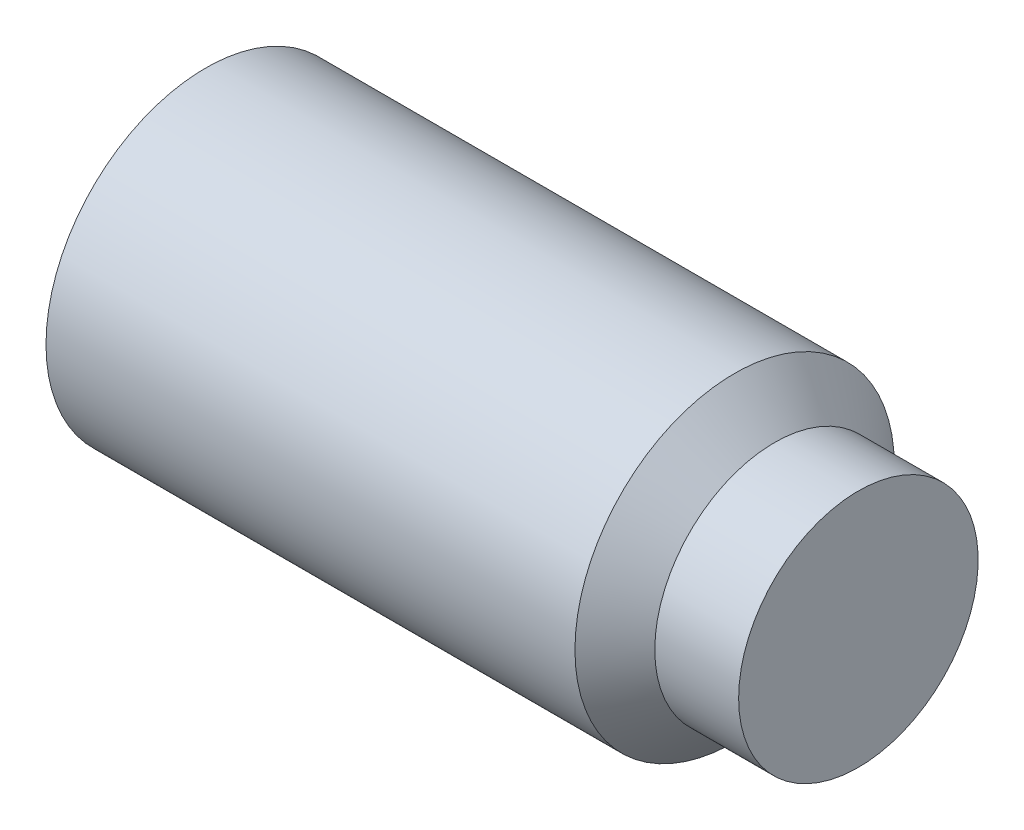
ISO-10303-21;
HEADER;
FILE_DESCRIPTION(('STEP AP214'),'2;1');
FILE_NAME('part.step','',(''),(''),'','','');
FILE_SCHEMA(('AUTOMOTIVE_DESIGN { 1 0 10303 214 1 1 1 1 }'));
ENDSEC;
DATA;
#1=APPLICATION_CONTEXT('core data for automotive mechanical design processes');
#2=APPLICATION_PROTOCOL_DEFINITION('international standard','automotive_design',2000,#1);
#3=PRODUCT_CONTEXT('',#1,'mechanical');
#4=PRODUCT('Part','Part','',(#3));
#5=PRODUCT_RELATED_PRODUCT_CATEGORY('part','',(#4));
#6=PRODUCT_DEFINITION_FORMATION('','',#4);
#7=PRODUCT_DEFINITION_CONTEXT('part definition',#1,'design');
#8=PRODUCT_DEFINITION('design','',#6,#7);
#9=PRODUCT_DEFINITION_SHAPE('','',#8);
#10=(LENGTH_UNIT() NAMED_UNIT(*) SI_UNIT(.MILLI.,.METRE.));
#11=(NAMED_UNIT(*) PLANE_ANGLE_UNIT() SI_UNIT($,.RADIAN.));
#12=(NAMED_UNIT(*) SI_UNIT($,.STERADIAN.) SOLID_ANGLE_UNIT());
#13=UNCERTAINTY_MEASURE_WITH_UNIT(LENGTH_MEASURE(1.E-05),#10,'distance_accuracy_value','');
#14=(GEOMETRIC_REPRESENTATION_CONTEXT(3) GLOBAL_UNCERTAINTY_ASSIGNED_CONTEXT((#13)) GLOBAL_UNIT_ASSIGNED_CONTEXT((#10,
#11,#12)) REPRESENTATION_CONTEXT('',''));
#15=CARTESIAN_POINT('',(0.,0.,0.));
#16=DIRECTION('',(0.,0.,1.));
#17=DIRECTION('',(1.,0.,0.));
#18=AXIS2_PLACEMENT_3D('',#15,#16,#17);
#19=CARTESIAN_POINT('',(0.,0.,0.));
#20=DIRECTION('',(-1.,0.,0.));
#21=DIRECTION('',(0.,0.,1.));
#22=AXIS2_PLACEMENT_3D('',#19,#20,#21);
#23=PLANE('',#22);
#24=CARTESIAN_POINT('',(0.,0.,0.));
#25=DIRECTION('',(-1.,0.,0.));
#26=DIRECTION('',(0.,0.,1.));
#27=AXIS2_PLACEMENT_3D('',#24,#25,#26);
#28=CIRCLE('',#27,10.352);
#29=CARTESIAN_POINT('',(0.,0.,10.352));
#30=VERTEX_POINT('',#29);
#31=EDGE_CURVE('E11',#30,#30,#28,.T.);
#32=ORIENTED_EDGE('',*,*,#31,.T.);
#33=EDGE_LOOP('',(#32));
#34=FACE_BOUND('',#33,.T.);
#35=DIRECTION('',(0.,0.,-1.));
#36=VECTOR('',#35,1.);
#37=CARTESIAN_POINT('',(0.,6.,3.46410161513775));
#38=LINE('',#37,#36);
#39=CARTESIAN_POINT('',(0.,6.,3.46410161513775));
#40=VERTEX_POINT('',#39);
#41=CARTESIAN_POINT('',(0.,6.,-3.46410161513776));
#42=VERTEX_POINT('',#41);
#43=EDGE_CURVE('E126',#40,#42,#38,.T.);
#44=ORIENTED_EDGE('',*,*,#43,.F.);
#45=DIRECTION('',(0.,-0.866025403784439,0.5));
#46=VECTOR('',#45,1.);
#47=CARTESIAN_POINT('',(0.,6.,3.46410161513775));
#48=LINE('',#47,#46);
#49=CARTESIAN_POINT('',(0.,0.,6.9282032302755));
#50=VERTEX_POINT('',#49);
#51=EDGE_CURVE('E48',#40,#50,#48,.T.);
#52=ORIENTED_EDGE('',*,*,#51,.T.);
#53=DIRECTION('',(0.,0.866025403784439,0.5));
#54=VECTOR('',#53,1.);
#55=CARTESIAN_POINT('',(0.,-5.99999999999999,3.46410161513775));
#56=LINE('',#55,#54);
#57=CARTESIAN_POINT('',(0.,-5.99999999999999,3.46410161513775));
#58=VERTEX_POINT('',#57);
#59=EDGE_CURVE('E117',#58,#50,#56,.T.);
#60=ORIENTED_EDGE('',*,*,#59,.F.);
#61=DIRECTION('',(0.,0.,-1.));
#62=VECTOR('',#61,1.);
#63=CARTESIAN_POINT('',(0.,-5.99999999999999,3.46410161513775));
#64=LINE('',#63,#62);
#65=CARTESIAN_POINT('',(0.,-5.99999999999999,-3.46410161513776));
#66=VERTEX_POINT('',#65);
#67=EDGE_CURVE('E120',#58,#66,#64,.T.);
#68=ORIENTED_EDGE('',*,*,#67,.T.);
#69=DIRECTION('',(0.,0.866025403784438,-0.5));
#70=VECTOR('',#69,1.);
#71=CARTESIAN_POINT('',(0.,-5.99999999999999,-3.46410161513776));
#72=LINE('',#71,#70);
#73=CARTESIAN_POINT('',(0.,0.,-6.92820323027551));
#74=VERTEX_POINT('',#73);
#75=EDGE_CURVE('E123',#66,#74,#72,.T.);
#76=ORIENTED_EDGE('',*,*,#75,.T.);
#77=DIRECTION('',(0.,-0.866025403784439,-0.5));
#78=VECTOR('',#77,1.);
#79=CARTESIAN_POINT('',(0.,6.,-3.46410161513776));
#80=LINE('',#79,#78);
#81=EDGE_CURVE('E106',#42,#74,#80,.T.);
#82=ORIENTED_EDGE('',*,*,#81,.F.);
#83=EDGE_LOOP('',(#44,#52,#60,#68,#76,#82));
#84=FACE_BOUND('',#83,.T.);
#85=ADVANCED_FACE('F34',(#34,#84),#23,.T.);
#86=CARTESIAN_POINT('',(0.,0.,0.));
#87=DIRECTION('',(1.,0.,0.));
#88=DIRECTION('',(0.,0.,-1.));
#89=AXIS2_PLACEMENT_3D('',#86,#87,#88);
#90=CONICAL_SURFACE('',#89,10.352,1.04719755119662);
#91=CARTESIAN_POINT('',(0.951473243624452,0.,0.));
#92=DIRECTION('',(-1.,0.,0.));
#93=DIRECTION('',(0.,0.,1.));
#94=AXIS2_PLACEMENT_3D('',#91,#92,#93);
#95=CIRCLE('',#94,12.);
#96=CARTESIAN_POINT('',(0.951473243624452,0.,12.));
#97=VERTEX_POINT('',#96);
#98=EDGE_CURVE('E41',#97,#97,#95,.T.);
#99=ORIENTED_EDGE('',*,*,#98,.T.);
#100=EDGE_LOOP('',(#99));
#101=FACE_BOUND('',#100,.T.);
#102=ORIENTED_EDGE('',*,*,#31,.F.);
#103=EDGE_LOOP('',(#102));
#104=FACE_BOUND('',#103,.T.);
#105=ADVANCED_FACE('F146',(#101,#104),#90,.T.);
#106=CARTESIAN_POINT('',(-12.7,0.,0.));
#107=DIRECTION('',(-1.,0.,0.));
#108=DIRECTION('',(0.,0.,1.));
#109=AXIS2_PLACEMENT_3D('',#106,#107,#108);
#110=CYLINDRICAL_SURFACE('',#109,12.);
#111=CARTESIAN_POINT('',(40.7,0.,0.));
#112=DIRECTION('',(-1.,0.,0.));
#113=DIRECTION('',(0.,0.,1.));
#114=AXIS2_PLACEMENT_3D('',#111,#112,#113);
#115=CIRCLE('',#114,12.);
#116=CARTESIAN_POINT('',(40.7,0.,12.));
#117=VERTEX_POINT('',#116);
#118=EDGE_CURVE('E141',#117,#117,#115,.T.);
#119=ORIENTED_EDGE('',*,*,#118,.T.);
#120=EDGE_LOOP('',(#119));
#121=FACE_BOUND('',#120,.T.);
#122=ORIENTED_EDGE('',*,*,#98,.F.);
#123=EDGE_LOOP('',(#122));
#124=FACE_BOUND('',#123,.T.);
#125=ADVANCED_FACE('F149',(#121,#124),#110,.T.);
#126=CARTESIAN_POINT('',(40.7,0.,0.));
#127=DIRECTION('',(-1.,0.,0.));
#128=DIRECTION('',(0.,0.,1.));
#129=AXIS2_PLACEMENT_3D('',#126,#127,#128);
#130=CONICAL_SURFACE('',#129,12.,0.785398163397447);
#131=CARTESIAN_POINT('',(43.7,0.,0.));
#132=DIRECTION('',(-1.,0.,0.));
#133=DIRECTION('',(0.,0.,1.));
#134=AXIS2_PLACEMENT_3D('',#131,#132,#133);
#135=CIRCLE('',#134,9.);
#136=CARTESIAN_POINT('',(43.7,0.,9.));
#137=VERTEX_POINT('',#136);
#138=EDGE_CURVE('E138',#137,#137,#135,.T.);
#139=ORIENTED_EDGE('',*,*,#138,.T.);
#140=EDGE_LOOP('',(#139));
#141=FACE_BOUND('',#140,.T.);
#142=ORIENTED_EDGE('',*,*,#118,.F.);
#143=EDGE_LOOP('',(#142));
#144=FACE_BOUND('',#143,.T.);
#145=ADVANCED_FACE('F151',(#141,#144),#130,.T.);
#146=CARTESIAN_POINT('',(-12.7,0.,0.));
#147=DIRECTION('',(-1.,0.,0.));
#148=DIRECTION('',(0.,0.,1.));
#149=AXIS2_PLACEMENT_3D('',#146,#147,#148);
#150=CYLINDRICAL_SURFACE('',#149,9.);
#151=CARTESIAN_POINT('',(50.,0.,0.));
#152=DIRECTION('',(-1.,0.,0.));
#153=DIRECTION('',(0.,0.,1.));
#154=AXIS2_PLACEMENT_3D('',#151,#152,#153);
#155=CIRCLE('',#154,9.);
#156=CARTESIAN_POINT('',(50.,0.,9.));
#157=VERTEX_POINT('',#156);
#158=EDGE_CURVE('E135',#157,#157,#155,.T.);
#159=ORIENTED_EDGE('',*,*,#158,.T.);
#160=EDGE_LOOP('',(#159));
#161=FACE_BOUND('',#160,.T.);
#162=ORIENTED_EDGE('',*,*,#138,.F.);
#163=EDGE_LOOP('',(#162));
#164=FACE_BOUND('',#163,.T.);
#165=ADVANCED_FACE('F158',(#161,#164),#150,.T.);
#166=CARTESIAN_POINT('',(50.,9.,0.));
#167=DIRECTION('',(1.,0.,0.));
#168=DIRECTION('',(0.,0.,-1.));
#169=AXIS2_PLACEMENT_3D('',#166,#167,#168);
#170=PLANE('',#169);
#171=ORIENTED_EDGE('',*,*,#158,.F.);
#172=EDGE_LOOP('',(#171));
#173=FACE_BOUND('',#172,.T.);
#174=ADVANCED_FACE('F193',(#173),#170,.T.);
#175=CARTESIAN_POINT('',(15.,6.,3.46410161513775));
#176=DIRECTION('',(0.,-0.5,-0.866025403784439));
#177=DIRECTION('',(0.,0.866025403784439,-0.5));
#178=AXIS2_PLACEMENT_3D('',#175,#176,#177);
#179=PLANE('',#178);
#180=ORIENTED_EDGE('',*,*,#51,.F.);
#181=DIRECTION('',(-1.,0.,0.));
#182=VECTOR('',#181,1.);
#183=CARTESIAN_POINT('',(15.,6.,3.46410161513775));
#184=LINE('',#183,#182);
#185=CARTESIAN_POINT('',(15.,6.,3.46410161513775));
#186=VERTEX_POINT('',#185);
#187=EDGE_CURVE('E53',#186,#40,#184,.T.);
#188=ORIENTED_EDGE('',*,*,#187,.F.);
#189=DIRECTION('',(0.,-0.866025403784439,0.5));
#190=VECTOR('',#189,1.);
#191=CARTESIAN_POINT('',(15.,6.,3.46410161513775));
#192=LINE('',#191,#190);
#193=CARTESIAN_POINT('',(15.,0.,6.9282032302755));
#194=VERTEX_POINT('',#193);
#195=EDGE_CURVE('E80',#186,#194,#192,.T.);
#196=ORIENTED_EDGE('',*,*,#195,.T.);
#197=DIRECTION('',(-1.,0.,0.));
#198=VECTOR('',#197,1.);
#199=CARTESIAN_POINT('',(15.,0.,6.9282032302755));
#200=LINE('',#199,#198);
#201=EDGE_CURVE('E133',#194,#50,#200,.T.);
#202=ORIENTED_EDGE('',*,*,#201,.T.);
#203=EDGE_LOOP('',(#180,#188,#196,#202));
#204=FACE_BOUND('',#203,.T.);
#205=ADVANCED_FACE('F189',(#204),#179,.T.);
#206=CARTESIAN_POINT('',(15.,-5.99999999999999,3.46410161513775));
#207=DIRECTION('',(0.,-0.5,0.866025403784439));
#208=DIRECTION('',(0.,-0.866025403784439,-0.5));
#209=AXIS2_PLACEMENT_3D('',#206,#207,#208);
#210=PLANE('',#209);
#211=ORIENTED_EDGE('',*,*,#59,.T.);
#212=ORIENTED_EDGE('',*,*,#201,.F.);
#213=DIRECTION('',(0.,0.866025403784439,0.5));
#214=VECTOR('',#213,1.);
#215=CARTESIAN_POINT('',(15.,-5.99999999999999,3.46410161513775));
#216=LINE('',#215,#214);
#217=CARTESIAN_POINT('',(15.,-5.99999999999999,3.46410161513775));
#218=VERTEX_POINT('',#217);
#219=EDGE_CURVE('E281',#218,#194,#216,.T.);
#220=ORIENTED_EDGE('',*,*,#219,.F.);
#221=DIRECTION('',(-1.,0.,0.));
#222=VECTOR('',#221,1.);
#223=CARTESIAN_POINT('',(15.,-5.99999999999999,3.46410161513775));
#224=LINE('',#223,#222);
#225=EDGE_CURVE('E131',#218,#58,#224,.T.);
#226=ORIENTED_EDGE('',*,*,#225,.T.);
#227=EDGE_LOOP('',(#211,#212,#220,#226));
#228=FACE_BOUND('',#227,.T.);
#229=ADVANCED_FACE('F185',(#228),#210,.F.);
#230=CARTESIAN_POINT('',(15.,-5.99999999999999,3.46410161513775));
#231=DIRECTION('',(0.,1.,0.));
#232=DIRECTION('',(0.,0.,1.));
#233=AXIS2_PLACEMENT_3D('',#230,#231,#232);
#234=PLANE('',#233);
#235=ORIENTED_EDGE('',*,*,#67,.F.);
#236=ORIENTED_EDGE('',*,*,#225,.F.);
#237=DIRECTION('',(0.,0.,-1.));
#238=VECTOR('',#237,1.);
#239=CARTESIAN_POINT('',(15.,-5.99999999999999,3.46410161513775));
#240=LINE('',#239,#238);
#241=CARTESIAN_POINT('',(15.,-5.99999999999999,-3.46410161513776));
#242=VERTEX_POINT('',#241);
#243=EDGE_CURVE('E101',#218,#242,#240,.T.);
#244=ORIENTED_EDGE('',*,*,#243,.T.);
#245=DIRECTION('',(-1.,0.,0.));
#246=VECTOR('',#245,1.);
#247=CARTESIAN_POINT('',(15.,-5.99999999999999,-3.46410161513776));
#248=LINE('',#247,#246);
#249=EDGE_CURVE('E96',#242,#66,#248,.T.);
#250=ORIENTED_EDGE('',*,*,#249,.T.);
#251=EDGE_LOOP('',(#235,#236,#244,#250));
#252=FACE_BOUND('',#251,.T.);
#253=ADVANCED_FACE('F182',(#252),#234,.T.);
#254=CARTESIAN_POINT('',(15.,-5.99999999999999,-3.46410161513776));
#255=DIRECTION('',(0.,0.5,0.866025403784438));
#256=DIRECTION('',(0.,-0.866025403784439,0.5));
#257=AXIS2_PLACEMENT_3D('',#254,#255,#256);
#258=PLANE('',#257);
#259=ORIENTED_EDGE('',*,*,#75,.F.);
#260=ORIENTED_EDGE('',*,*,#249,.F.);
#261=DIRECTION('',(0.,0.866025403784438,-0.5));
#262=VECTOR('',#261,1.);
#263=CARTESIAN_POINT('',(15.,-5.99999999999999,-3.46410161513776));
#264=LINE('',#263,#262);
#265=CARTESIAN_POINT('',(15.,0.,-6.92820323027551));
#266=VERTEX_POINT('',#265);
#267=EDGE_CURVE('E91',#242,#266,#264,.T.);
#268=ORIENTED_EDGE('',*,*,#267,.T.);
#269=DIRECTION('',(-1.,0.,0.));
#270=VECTOR('',#269,1.);
#271=CARTESIAN_POINT('',(15.,0.,-6.92820323027551));
#272=LINE('',#271,#270);
#273=EDGE_CURVE('E95',#266,#74,#272,.T.);
#274=ORIENTED_EDGE('',*,*,#273,.T.);
#275=EDGE_LOOP('',(#259,#260,#268,#274));
#276=FACE_BOUND('',#275,.T.);
#277=ADVANCED_FACE('F94',(#276),#258,.T.);
#278=CARTESIAN_POINT('',(15.,6.,-3.46410161513776));
#279=DIRECTION('',(0.,0.5,-0.866025403784438));
#280=DIRECTION('',(0.,0.866025403784439,0.5));
#281=AXIS2_PLACEMENT_3D('',#278,#279,#280);
#282=PLANE('',#281);
#283=ORIENTED_EDGE('',*,*,#81,.T.);
#284=ORIENTED_EDGE('',*,*,#273,.F.);
#285=DIRECTION('',(0.,-0.866025403784439,-0.5));
#286=VECTOR('',#285,1.);
#287=CARTESIAN_POINT('',(15.,6.,-3.46410161513776));
#288=LINE('',#287,#286);
#289=CARTESIAN_POINT('',(15.,6.,-3.46410161513776));
#290=VERTEX_POINT('',#289);
#291=EDGE_CURVE('E100',#290,#266,#288,.T.);
#292=ORIENTED_EDGE('',*,*,#291,.F.);
#293=DIRECTION('',(-1.,0.,0.));
#294=VECTOR('',#293,1.);
#295=CARTESIAN_POINT('',(15.,6.,-3.46410161513776));
#296=LINE('',#295,#294);
#297=EDGE_CURVE('E76',#290,#42,#296,.T.);
#298=ORIENTED_EDGE('',*,*,#297,.T.);
#299=EDGE_LOOP('',(#283,#284,#292,#298));
#300=FACE_BOUND('',#299,.T.);
#301=ADVANCED_FACE('F103',(#300),#282,.F.);
#302=CARTESIAN_POINT('',(15.,6.,3.46410161513775));
#303=DIRECTION('',(0.,1.,0.));
#304=DIRECTION('',(0.,0.,1.));
#305=AXIS2_PLACEMENT_3D('',#302,#303,#304);
#306=PLANE('',#305);
#307=ORIENTED_EDGE('',*,*,#43,.T.);
#308=ORIENTED_EDGE('',*,*,#297,.F.);
#309=DIRECTION('',(0.,0.,-1.));
#310=VECTOR('',#309,1.);
#311=CARTESIAN_POINT('',(15.,6.,3.46410161513775));
#312=LINE('',#311,#310);
#313=EDGE_CURVE('E111',#186,#290,#312,.T.);
#314=ORIENTED_EDGE('',*,*,#313,.F.);
#315=ORIENTED_EDGE('',*,*,#187,.T.);
#316=EDGE_LOOP('',(#307,#308,#314,#315));
#317=FACE_BOUND('',#316,.T.);
#318=ADVANCED_FACE('F170',(#317),#306,.F.);
#319=CARTESIAN_POINT('',(15.,6.,3.46410161513775));
#320=DIRECTION('',(1.,0.,0.));
#321=DIRECTION('',(0.,0.,-1.));
#322=AXIS2_PLACEMENT_3D('',#319,#320,#321);
#323=PLANE('',#322);
#324=ORIENTED_EDGE('',*,*,#195,.F.);
#325=ORIENTED_EDGE('',*,*,#313,.T.);
#326=ORIENTED_EDGE('',*,*,#291,.T.);
#327=ORIENTED_EDGE('',*,*,#267,.F.);
#328=ORIENTED_EDGE('',*,*,#243,.F.);
#329=ORIENTED_EDGE('',*,*,#219,.T.);
#330=EDGE_LOOP('',(#324,#325,#326,#327,#328,#329));
#331=FACE_BOUND('',#330,.T.);
#332=ADVANCED_FACE('F109',(#331),#323,.F.);
#333=CLOSED_SHELL('',(#85,#105,#125,#145,#165,#174,#205,#229,#253,#277,#301,#318,#332));
#334=MANIFOLD_SOLID_BREP('B2',#333);
#335=ADVANCED_BREP_SHAPE_REPRESENTATION('',(#18,#334),#14);
#336=SHAPE_DEFINITION_REPRESENTATION(#9,#335);
ENDSEC;
END-ISO-10303-21;
